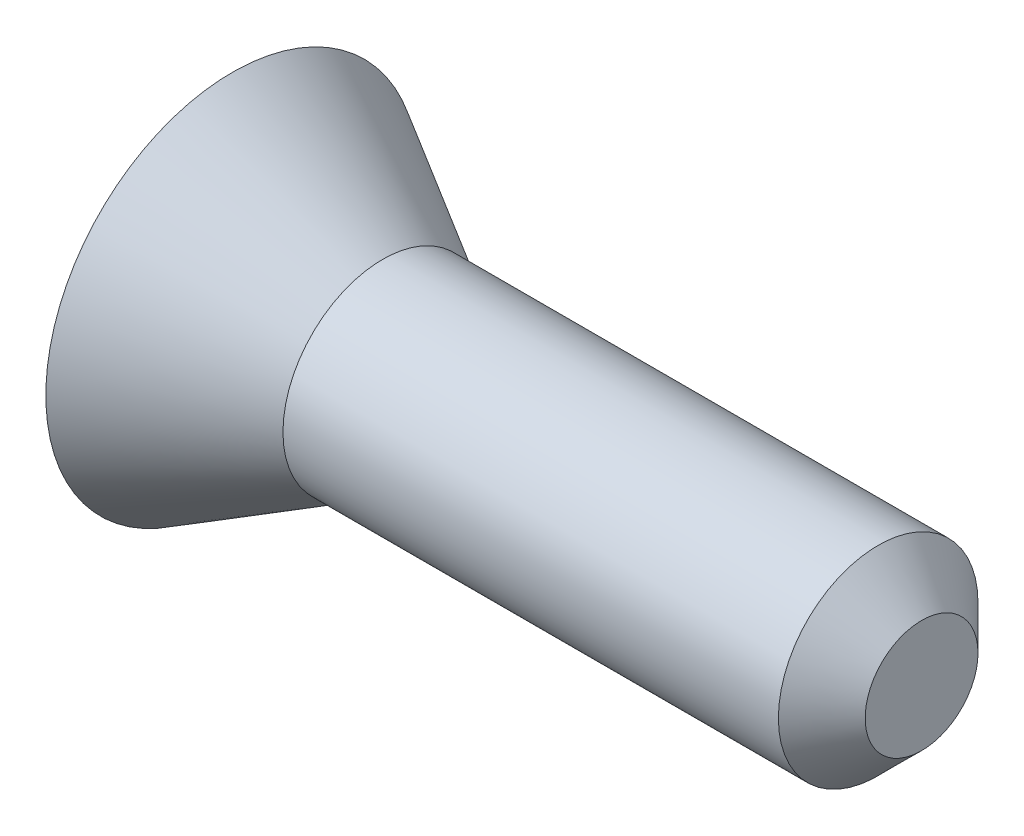
ISO-10303-21;
HEADER;
FILE_DESCRIPTION(('STEP AP214'),'2;1');
FILE_NAME('part.step','',(''),(''),'','','');
FILE_SCHEMA(('AUTOMOTIVE_DESIGN { 1 0 10303 214 1 1 1 1 }'));
ENDSEC;
DATA;
#1=APPLICATION_CONTEXT('core data for automotive mechanical design processes');
#2=APPLICATION_PROTOCOL_DEFINITION('international standard','automotive_design',2000,#1);
#3=PRODUCT_CONTEXT('',#1,'mechanical');
#4=PRODUCT('Part','Part','',(#3));
#5=PRODUCT_RELATED_PRODUCT_CATEGORY('part','',(#4));
#6=PRODUCT_DEFINITION_FORMATION('','',#4);
#7=PRODUCT_DEFINITION_CONTEXT('part definition',#1,'design');
#8=PRODUCT_DEFINITION('design','',#6,#7);
#9=PRODUCT_DEFINITION_SHAPE('','',#8);
#10=(LENGTH_UNIT() NAMED_UNIT(*) SI_UNIT(.MILLI.,.METRE.));
#11=(NAMED_UNIT(*) PLANE_ANGLE_UNIT() SI_UNIT($,.RADIAN.));
#12=(NAMED_UNIT(*) SI_UNIT($,.STERADIAN.) SOLID_ANGLE_UNIT());
#13=UNCERTAINTY_MEASURE_WITH_UNIT(LENGTH_MEASURE(1.E-05),#10,'distance_accuracy_value','');
#14=(GEOMETRIC_REPRESENTATION_CONTEXT(3) GLOBAL_UNCERTAINTY_ASSIGNED_CONTEXT((#13)) GLOBAL_UNIT_ASSIGNED_CONTEXT((#10,
#11,#12)) REPRESENTATION_CONTEXT('',''));
#15=CARTESIAN_POINT('',(0.,0.,0.));
#16=DIRECTION('',(0.,0.,1.));
#17=DIRECTION('',(1.,0.,0.));
#18=AXIS2_PLACEMENT_3D('',#15,#16,#17);
#19=CARTESIAN_POINT('',(2.19970452523541,0.,0.));
#20=DIRECTION('',(-1.,0.,0.));
#21=DIRECTION('',(0.,0.,1.));
#22=AXIS2_PLACEMENT_3D('',#19,#20,#21);
#23=CONICAL_SURFACE('',#22,1.4604999993469,0.523598775598299);
#24=CARTESIAN_POINT('',(-3.97903932025656E-10,0.,0.));
#25=DIRECTION('',(1.,0.,0.));
#26=DIRECTION('',(0.,0.,-1.));
#27=AXIS2_PLACEMENT_3D('',#24,#25,#26);
#28=CIRCLE('',#27,2.73049999935893);
#29=CARTESIAN_POINT('',(-3.97903932025656E-10,0.,-2.73049999935893));
#30=VERTEX_POINT('',#29);
#31=EDGE_CURVE('E11',#30,#30,#28,.T.);
#32=ORIENTED_EDGE('',*,*,#31,.T.);
#33=EDGE_LOOP('',(#32));
#34=FACE_BOUND('',#33,.T.);
#35=CARTESIAN_POINT('',(2.19970452523541,0.,0.));
#36=DIRECTION('',(1.,0.,0.));
#37=DIRECTION('',(0.,0.,-1.));
#38=AXIS2_PLACEMENT_3D('',#35,#36,#37);
#39=CIRCLE('',#38,1.4604999993469);
#40=CARTESIAN_POINT('',(2.19970452523541,0.,-1.4604999993469));
#41=VERTEX_POINT('',#40);
#42=EDGE_CURVE('E127',#41,#41,#39,.T.);
#43=ORIENTED_EDGE('',*,*,#42,.F.);
#44=EDGE_LOOP('',(#43));
#45=FACE_BOUND('',#44,.T.);
#46=ADVANCED_FACE('F32',(#34,#45),#23,.T.);
#47=CARTESIAN_POINT('',(-3.97903932025656E-10,2.73049999935893,0.));
#48=DIRECTION('',(-1.,0.,0.));
#49=DIRECTION('',(0.,0.,1.));
#50=AXIS2_PLACEMENT_3D('',#47,#48,#49);
#51=PLANE('',#50);
#52=DIRECTION('',(0.,1.,0.));
#53=VECTOR('',#52,1.);
#54=CARTESIAN_POINT('',(-3.97903932025656E-10,0.3429,-0.3429));
#55=LINE('',#54,#53);
#56=CARTESIAN_POINT('',(-3.97903932025656E-10,0.3429,-0.3429));
#57=VERTEX_POINT('',#56);
#58=CARTESIAN_POINT('',(-3.97903932025656E-10,1.524,-0.3429));
#59=VERTEX_POINT('',#58);
#60=EDGE_CURVE('E130',#57,#59,#55,.T.);
#61=ORIENTED_EDGE('',*,*,#60,.T.);
#62=DIRECTION('',(0.,0.,1.));
#63=VECTOR('',#62,1.);
#64=CARTESIAN_POINT('',(-3.97903932025656E-10,1.524,-0.3429));
#65=LINE('',#64,#63);
#66=CARTESIAN_POINT('',(-3.97903932025656E-10,1.524,0.3429));
#67=VERTEX_POINT('',#66);
#68=EDGE_CURVE('E119',#59,#67,#65,.T.);
#69=ORIENTED_EDGE('',*,*,#68,.T.);
#70=DIRECTION('',(0.,-1.,0.));
#71=VECTOR('',#70,1.);
#72=CARTESIAN_POINT('',(-3.97903932025656E-10,1.524,0.3429));
#73=LINE('',#72,#71);
#74=CARTESIAN_POINT('',(-3.97903932025656E-10,0.3429,0.3429));
#75=VERTEX_POINT('',#74);
#76=EDGE_CURVE('E406',#67,#75,#73,.T.);
#77=ORIENTED_EDGE('',*,*,#76,.T.);
#78=DIRECTION('',(0.,0.,1.));
#79=VECTOR('',#78,1.);
#80=CARTESIAN_POINT('',(-3.97903932025656E-10,0.3429,0.3429));
#81=LINE('',#80,#79);
#82=CARTESIAN_POINT('',(-3.97903932025656E-10,0.3429,1.524));
#83=VERTEX_POINT('',#82);
#84=EDGE_CURVE('E403',#75,#83,#81,.T.);
#85=ORIENTED_EDGE('',*,*,#84,.T.);
#86=DIRECTION('',(0.,-1.,0.));
#87=VECTOR('',#86,1.);
#88=CARTESIAN_POINT('',(-3.97903932025656E-10,0.3429,1.524));
#89=LINE('',#88,#87);
#90=CARTESIAN_POINT('',(-3.97903932025656E-10,-0.3429,1.524));
#91=VERTEX_POINT('',#90);
#92=EDGE_CURVE('E400',#83,#91,#89,.T.);
#93=ORIENTED_EDGE('',*,*,#92,.T.);
#94=DIRECTION('',(0.,0.,-1.));
#95=VECTOR('',#94,1.);
#96=CARTESIAN_POINT('',(-3.97903932025656E-10,-0.3429,1.524));
#97=LINE('',#96,#95);
#98=CARTESIAN_POINT('',(-3.97903932025656E-10,-0.3429,0.3429));
#99=VERTEX_POINT('',#98);
#100=EDGE_CURVE('E397',#91,#99,#97,.T.);
#101=ORIENTED_EDGE('',*,*,#100,.T.);
#102=DIRECTION('',(0.,-1.,0.));
#103=VECTOR('',#102,1.);
#104=CARTESIAN_POINT('',(-3.97903932025656E-10,-0.3429,0.3429));
#105=LINE('',#104,#103);
#106=CARTESIAN_POINT('',(-3.97903932025656E-10,-1.524,0.3429));
#107=VERTEX_POINT('',#106);
#108=EDGE_CURVE('E393',#99,#107,#105,.T.);
#109=ORIENTED_EDGE('',*,*,#108,.T.);
#110=DIRECTION('',(0.,0.,-1.));
#111=VECTOR('',#110,1.);
#112=CARTESIAN_POINT('',(-3.97903932025656E-10,-1.524,0.3429));
#113=LINE('',#112,#111);
#114=CARTESIAN_POINT('',(-3.97903932025656E-10,-1.524,-0.3429));
#115=VERTEX_POINT('',#114);
#116=EDGE_CURVE('E390',#107,#115,#113,.T.);
#117=ORIENTED_EDGE('',*,*,#116,.T.);
#118=DIRECTION('',(0.,1.,0.));
#119=VECTOR('',#118,1.);
#120=CARTESIAN_POINT('',(-3.97903932025656E-10,-1.524,-0.3429));
#121=LINE('',#120,#119);
#122=CARTESIAN_POINT('',(-3.97903932025656E-10,-0.3429,-0.3429));
#123=VERTEX_POINT('',#122);
#124=EDGE_CURVE('E386',#115,#123,#121,.T.);
#125=ORIENTED_EDGE('',*,*,#124,.T.);
#126=DIRECTION('',(0.,0.,-1.));
#127=VECTOR('',#126,1.);
#128=CARTESIAN_POINT('',(-3.97903932025656E-10,-0.3429,-0.3429));
#129=LINE('',#128,#127);
#130=CARTESIAN_POINT('',(-3.97903932025656E-10,-0.3429,-1.524));
#131=VERTEX_POINT('',#130);
#132=EDGE_CURVE('E384',#123,#131,#129,.T.);
#133=ORIENTED_EDGE('',*,*,#132,.T.);
#134=DIRECTION('',(0.,1.,0.));
#135=VECTOR('',#134,1.);
#136=CARTESIAN_POINT('',(-3.97903932025656E-10,-0.3429,-1.524));
#137=LINE('',#136,#135);
#138=CARTESIAN_POINT('',(-3.97903932025656E-10,0.3429,-1.524));
#139=VERTEX_POINT('',#138);
#140=EDGE_CURVE('E142',#131,#139,#137,.T.);
#141=ORIENTED_EDGE('',*,*,#140,.T.);
#142=DIRECTION('',(0.,0.,1.));
#143=VECTOR('',#142,1.);
#144=CARTESIAN_POINT('',(-3.97903932025656E-10,0.3429,-1.524));
#145=LINE('',#144,#143);
#146=EDGE_CURVE('E138',#139,#57,#145,.T.);
#147=ORIENTED_EDGE('',*,*,#146,.T.);
#148=EDGE_LOOP('',(#61,#69,#77,#85,#93,#101,#109,#117,#125,#133,#141,#147));
#149=FACE_BOUND('',#148,.T.);
#150=ORIENTED_EDGE('',*,*,#31,.F.);
#151=EDGE_LOOP('',(#150));
#152=FACE_BOUND('',#151,.T.);
#153=ADVANCED_FACE('F135',(#149,#152),#51,.T.);
#154=CARTESIAN_POINT('',(10.0837999996509,0.,0.));
#155=DIRECTION('',(1.,0.,0.));
#156=DIRECTION('',(0.,0.,-1.));
#157=AXIS2_PLACEMENT_3D('',#154,#155,#156);
#158=PLANE('',#157);
#159=CARTESIAN_POINT('',(10.0837999996509,0.,0.));
#160=DIRECTION('',(1.,0.,0.));
#161=DIRECTION('',(0.,0.,-1.));
#162=AXIS2_PLACEMENT_3D('',#159,#160,#161);
#163=CIRCLE('',#162,0.825499999318948);
#164=CARTESIAN_POINT('',(10.0837999996509,0.,-0.825499999318948));
#165=VERTEX_POINT('',#164);
#166=EDGE_CURVE('E39',#165,#165,#163,.T.);
#167=ORIENTED_EDGE('',*,*,#166,.T.);
#168=EDGE_LOOP('',(#167));
#169=FACE_BOUND('',#168,.T.);
#170=ADVANCED_FACE('F203',(#169),#158,.T.);
#171=CARTESIAN_POINT('',(10.0837999996509,0.,0.));
#172=DIRECTION('',(-1.,0.,0.));
#173=DIRECTION('',(0.,0.,1.));
#174=AXIS2_PLACEMENT_3D('',#171,#172,#173);
#175=CONICAL_SURFACE('',#174,0.825499999318948,0.785398163397448);
#176=CARTESIAN_POINT('',(9.44879999962293,0.,0.));
#177=DIRECTION('',(1.,0.,0.));
#178=DIRECTION('',(0.,0.,-1.));
#179=AXIS2_PLACEMENT_3D('',#176,#177,#178);
#180=CIRCLE('',#179,1.4604999993469);
#181=CARTESIAN_POINT('',(9.44879999962293,0.,-1.4604999993469));
#182=VERTEX_POINT('',#181);
#183=EDGE_CURVE('E198',#182,#182,#180,.T.);
#184=ORIENTED_EDGE('',*,*,#183,.T.);
#185=EDGE_LOOP('',(#184));
#186=FACE_BOUND('',#185,.T.);
#187=ORIENTED_EDGE('',*,*,#166,.F.);
#188=EDGE_LOOP('',(#187));
#189=FACE_BOUND('',#188,.T.);
#190=ADVANCED_FACE('F205',(#186,#189),#175,.T.);
#191=CARTESIAN_POINT('',(-3.97903932025656E-10,0.,0.));
#192=DIRECTION('',(1.,0.,0.));
#193=DIRECTION('',(0.,0.,-1.));
#194=AXIS2_PLACEMENT_3D('',#191,#192,#193);
#195=CYLINDRICAL_SURFACE('',#194,1.4604999993469);
#196=ORIENTED_EDGE('',*,*,#42,.T.);
#197=EDGE_LOOP('',(#196));
#198=FACE_BOUND('',#197,.T.);
#199=ORIENTED_EDGE('',*,*,#183,.F.);
#200=EDGE_LOOP('',(#199));
#201=FACE_BOUND('',#200,.T.);
#202=ADVANCED_FACE('F207',(#198,#201),#195,.T.);
#203=CARTESIAN_POINT('',(-0.00100000039790385,0.3429,-0.3429));
#204=DIRECTION('',(0.,0.,-1.));
#205=DIRECTION('',(-1.,0.,0.));
#206=AXIS2_PLACEMENT_3D('',#203,#204,#205);
#207=PLANE('',#206);
#208=DIRECTION('',(1.,0.,0.));
#209=VECTOR('',#208,1.);
#210=CARTESIAN_POINT('',(-0.00100000039790385,0.3429,-0.3429));
#211=LINE('',#210,#209);
#212=CARTESIAN_POINT('',(1.905,0.3429,-0.3429));
#213=VERTEX_POINT('',#212);
#214=EDGE_CURVE('E54',#57,#213,#211,.T.);
#215=ORIENTED_EDGE('',*,*,#214,.T.);
#216=DIRECTION('',(0.,1.,0.));
#217=VECTOR('',#216,1.);
#218=CARTESIAN_POINT('',(1.905,0.3429,-0.3429));
#219=LINE('',#218,#217);
#220=CARTESIAN_POINT('',(1.905,1.524,-0.3429));
#221=VERTEX_POINT('',#220);
#222=EDGE_CURVE('E131',#213,#221,#219,.T.);
#223=ORIENTED_EDGE('',*,*,#222,.T.);
#224=DIRECTION('',(1.,0.,0.));
#225=VECTOR('',#224,1.);
#226=CARTESIAN_POINT('',(-0.00100000039790385,1.524,-0.3429));
#227=LINE('',#226,#225);
#228=EDGE_CURVE('E122',#59,#221,#227,.T.);
#229=ORIENTED_EDGE('',*,*,#228,.F.);
#230=ORIENTED_EDGE('',*,*,#60,.F.);
#231=EDGE_LOOP('',(#215,#223,#229,#230));
#232=FACE_BOUND('',#231,.T.);
#233=ADVANCED_FACE('F129',(#232),#207,.F.);
#234=CARTESIAN_POINT('',(-0.00100000039790385,0.3429,-1.524));
#235=DIRECTION('',(0.,1.,0.));
#236=DIRECTION('',(0.,0.,1.));
#237=AXIS2_PLACEMENT_3D('',#234,#235,#236);
#238=PLANE('',#237);
#239=DIRECTION('',(1.,0.,0.));
#240=VECTOR('',#239,1.);
#241=CARTESIAN_POINT('',(-0.00100000039790385,0.3429,-1.524));
#242=LINE('',#241,#240);
#243=CARTESIAN_POINT('',(1.905,0.3429,-1.524));
#244=VERTEX_POINT('',#243);
#245=EDGE_CURVE('E177',#139,#244,#242,.T.);
#246=ORIENTED_EDGE('',*,*,#245,.T.);
#247=DIRECTION('',(0.,0.,1.));
#248=VECTOR('',#247,1.);
#249=CARTESIAN_POINT('',(1.905,0.3429,-1.524));
#250=LINE('',#249,#248);
#251=EDGE_CURVE('E132',#244,#213,#250,.T.);
#252=ORIENTED_EDGE('',*,*,#251,.T.);
#253=ORIENTED_EDGE('',*,*,#214,.F.);
#254=ORIENTED_EDGE('',*,*,#146,.F.);
#255=EDGE_LOOP('',(#246,#252,#253,#254));
#256=FACE_BOUND('',#255,.T.);
#257=ADVANCED_FACE('F254',(#256),#238,.F.);
#258=CARTESIAN_POINT('',(-0.00100000039790385,-0.3429,-1.524));
#259=DIRECTION('',(0.,0.,-1.));
#260=DIRECTION('',(-1.,0.,0.));
#261=AXIS2_PLACEMENT_3D('',#258,#259,#260);
#262=PLANE('',#261);
#263=DIRECTION('',(1.,0.,0.));
#264=VECTOR('',#263,1.);
#265=CARTESIAN_POINT('',(-0.00100000039790385,-0.3429,-1.524));
#266=LINE('',#265,#264);
#267=CARTESIAN_POINT('',(1.905,-0.3429,-1.524));
#268=VERTEX_POINT('',#267);
#269=EDGE_CURVE('E179',#131,#268,#266,.T.);
#270=ORIENTED_EDGE('',*,*,#269,.T.);
#271=DIRECTION('',(0.,1.,0.));
#272=VECTOR('',#271,1.);
#273=CARTESIAN_POINT('',(1.905,-0.3429,-1.524));
#274=LINE('',#273,#272);
#275=EDGE_CURVE('E171',#268,#244,#274,.T.);
#276=ORIENTED_EDGE('',*,*,#275,.T.);
#277=ORIENTED_EDGE('',*,*,#245,.F.);
#278=ORIENTED_EDGE('',*,*,#140,.F.);
#279=EDGE_LOOP('',(#270,#276,#277,#278));
#280=FACE_BOUND('',#279,.T.);
#281=ADVANCED_FACE('F260',(#280),#262,.F.);
#282=CARTESIAN_POINT('',(-0.00100000039790385,-0.3429,-0.3429));
#283=DIRECTION('',(0.,-1.,0.));
#284=DIRECTION('',(0.,0.,-1.));
#285=AXIS2_PLACEMENT_3D('',#282,#283,#284);
#286=PLANE('',#285);
#287=DIRECTION('',(1.,0.,0.));
#288=VECTOR('',#287,1.);
#289=CARTESIAN_POINT('',(-0.00100000039790385,-0.3429,-0.3429));
#290=LINE('',#289,#288);
#291=CARTESIAN_POINT('',(1.905,-0.3429,-0.3429));
#292=VERTEX_POINT('',#291);
#293=EDGE_CURVE('E181',#123,#292,#290,.T.);
#294=ORIENTED_EDGE('',*,*,#293,.T.);
#295=DIRECTION('',(0.,0.,-1.));
#296=VECTOR('',#295,1.);
#297=CARTESIAN_POINT('',(1.905,-0.3429,-0.3429));
#298=LINE('',#297,#296);
#299=EDGE_CURVE('E168',#292,#268,#298,.T.);
#300=ORIENTED_EDGE('',*,*,#299,.T.);
#301=ORIENTED_EDGE('',*,*,#269,.F.);
#302=ORIENTED_EDGE('',*,*,#132,.F.);
#303=EDGE_LOOP('',(#294,#300,#301,#302));
#304=FACE_BOUND('',#303,.T.);
#305=ADVANCED_FACE('F268',(#304),#286,.F.);
#306=CARTESIAN_POINT('',(-0.00100000039790385,-1.524,-0.3429));
#307=DIRECTION('',(0.,0.,-1.));
#308=DIRECTION('',(-1.,0.,0.));
#309=AXIS2_PLACEMENT_3D('',#306,#307,#308);
#310=PLANE('',#309);
#311=DIRECTION('',(1.,0.,0.));
#312=VECTOR('',#311,1.);
#313=CARTESIAN_POINT('',(-0.00100000039790385,-1.524,-0.3429));
#314=LINE('',#313,#312);
#315=CARTESIAN_POINT('',(1.905,-1.524,-0.3429));
#316=VERTEX_POINT('',#315);
#317=EDGE_CURVE('E183',#115,#316,#314,.T.);
#318=ORIENTED_EDGE('',*,*,#317,.T.);
#319=DIRECTION('',(0.,1.,0.));
#320=VECTOR('',#319,1.);
#321=CARTESIAN_POINT('',(1.905,-1.524,-0.3429));
#322=LINE('',#321,#320);
#323=EDGE_CURVE('E165',#316,#292,#322,.T.);
#324=ORIENTED_EDGE('',*,*,#323,.T.);
#325=ORIENTED_EDGE('',*,*,#293,.F.);
#326=ORIENTED_EDGE('',*,*,#124,.F.);
#327=EDGE_LOOP('',(#318,#324,#325,#326));
#328=FACE_BOUND('',#327,.T.);
#329=ADVANCED_FACE('F276',(#328),#310,.F.);
#330=CARTESIAN_POINT('',(-0.00100000039790385,-1.524,0.3429));
#331=DIRECTION('',(0.,-1.,0.));
#332=DIRECTION('',(0.,0.,-1.));
#333=AXIS2_PLACEMENT_3D('',#330,#331,#332);
#334=PLANE('',#333);
#335=DIRECTION('',(1.,0.,0.));
#336=VECTOR('',#335,1.);
#337=CARTESIAN_POINT('',(-0.00100000039790385,-1.524,0.3429));
#338=LINE('',#337,#336);
#339=CARTESIAN_POINT('',(1.905,-1.524,0.3429));
#340=VERTEX_POINT('',#339);
#341=EDGE_CURVE('E185',#107,#340,#338,.T.);
#342=ORIENTED_EDGE('',*,*,#341,.T.);
#343=DIRECTION('',(0.,0.,-1.));
#344=VECTOR('',#343,1.);
#345=CARTESIAN_POINT('',(1.905,-1.524,0.3429));
#346=LINE('',#345,#344);
#347=EDGE_CURVE('E162',#340,#316,#346,.T.);
#348=ORIENTED_EDGE('',*,*,#347,.T.);
#349=ORIENTED_EDGE('',*,*,#317,.F.);
#350=ORIENTED_EDGE('',*,*,#116,.F.);
#351=EDGE_LOOP('',(#342,#348,#349,#350));
#352=FACE_BOUND('',#351,.T.);
#353=ADVANCED_FACE('F284',(#352),#334,.F.);
#354=CARTESIAN_POINT('',(-0.00100000039790385,-0.3429,0.3429));
#355=DIRECTION('',(0.,0.,1.));
#356=DIRECTION('',(1.,0.,0.));
#357=AXIS2_PLACEMENT_3D('',#354,#355,#356);
#358=PLANE('',#357);
#359=DIRECTION('',(1.,0.,0.));
#360=VECTOR('',#359,1.);
#361=CARTESIAN_POINT('',(-0.00100000039790385,-0.3429,0.3429));
#362=LINE('',#361,#360);
#363=CARTESIAN_POINT('',(1.905,-0.3429,0.3429));
#364=VERTEX_POINT('',#363);
#365=EDGE_CURVE('E187',#99,#364,#362,.T.);
#366=ORIENTED_EDGE('',*,*,#365,.T.);
#367=DIRECTION('',(0.,-1.,0.));
#368=VECTOR('',#367,1.);
#369=CARTESIAN_POINT('',(1.905,-0.3429,0.3429));
#370=LINE('',#369,#368);
#371=EDGE_CURVE('E159',#364,#340,#370,.T.);
#372=ORIENTED_EDGE('',*,*,#371,.T.);
#373=ORIENTED_EDGE('',*,*,#341,.F.);
#374=ORIENTED_EDGE('',*,*,#108,.F.);
#375=EDGE_LOOP('',(#366,#372,#373,#374));
#376=FACE_BOUND('',#375,.T.);
#377=ADVANCED_FACE('F292',(#376),#358,.F.);
#378=CARTESIAN_POINT('',(-0.00100000039790385,-0.3429,1.524));
#379=DIRECTION('',(0.,-1.,0.));
#380=DIRECTION('',(0.,0.,-1.));
#381=AXIS2_PLACEMENT_3D('',#378,#379,#380);
#382=PLANE('',#381);
#383=DIRECTION('',(1.,0.,0.));
#384=VECTOR('',#383,1.);
#385=CARTESIAN_POINT('',(-0.00100000039790385,-0.3429,1.524));
#386=LINE('',#385,#384);
#387=CARTESIAN_POINT('',(1.905,-0.3429,1.524));
#388=VERTEX_POINT('',#387);
#389=EDGE_CURVE('E189',#91,#388,#386,.T.);
#390=ORIENTED_EDGE('',*,*,#389,.T.);
#391=DIRECTION('',(0.,0.,-1.));
#392=VECTOR('',#391,1.);
#393=CARTESIAN_POINT('',(1.905,-0.3429,1.524));
#394=LINE('',#393,#392);
#395=EDGE_CURVE('E156',#388,#364,#394,.T.);
#396=ORIENTED_EDGE('',*,*,#395,.T.);
#397=ORIENTED_EDGE('',*,*,#365,.F.);
#398=ORIENTED_EDGE('',*,*,#100,.F.);
#399=EDGE_LOOP('',(#390,#396,#397,#398));
#400=FACE_BOUND('',#399,.T.);
#401=ADVANCED_FACE('F300',(#400),#382,.F.);
#402=CARTESIAN_POINT('',(-0.00100000039790385,0.3429,1.524));
#403=DIRECTION('',(0.,0.,1.));
#404=DIRECTION('',(1.,0.,0.));
#405=AXIS2_PLACEMENT_3D('',#402,#403,#404);
#406=PLANE('',#405);
#407=DIRECTION('',(1.,0.,0.));
#408=VECTOR('',#407,1.);
#409=CARTESIAN_POINT('',(-0.00100000039790385,0.3429,1.524));
#410=LINE('',#409,#408);
#411=CARTESIAN_POINT('',(1.905,0.3429,1.524));
#412=VERTEX_POINT('',#411);
#413=EDGE_CURVE('E191',#83,#412,#410,.T.);
#414=ORIENTED_EDGE('',*,*,#413,.T.);
#415=DIRECTION('',(0.,-1.,0.));
#416=VECTOR('',#415,1.);
#417=CARTESIAN_POINT('',(1.905,0.3429,1.524));
#418=LINE('',#417,#416);
#419=EDGE_CURVE('E153',#412,#388,#418,.T.);
#420=ORIENTED_EDGE('',*,*,#419,.T.);
#421=ORIENTED_EDGE('',*,*,#389,.F.);
#422=ORIENTED_EDGE('',*,*,#92,.F.);
#423=EDGE_LOOP('',(#414,#420,#421,#422));
#424=FACE_BOUND('',#423,.T.);
#425=ADVANCED_FACE('F308',(#424),#406,.F.);
#426=CARTESIAN_POINT('',(-0.00100000039790385,0.3429,0.3429));
#427=DIRECTION('',(0.,1.,0.));
#428=DIRECTION('',(0.,0.,1.));
#429=AXIS2_PLACEMENT_3D('',#426,#427,#428);
#430=PLANE('',#429);
#431=DIRECTION('',(1.,0.,0.));
#432=VECTOR('',#431,1.);
#433=CARTESIAN_POINT('',(-0.00100000039790385,0.3429,0.3429));
#434=LINE('',#433,#432);
#435=CARTESIAN_POINT('',(1.905,0.3429,0.3429));
#436=VERTEX_POINT('',#435);
#437=EDGE_CURVE('E193',#75,#436,#434,.T.);
#438=ORIENTED_EDGE('',*,*,#437,.T.);
#439=DIRECTION('',(0.,0.,1.));
#440=VECTOR('',#439,1.);
#441=CARTESIAN_POINT('',(1.905,0.3429,0.3429));
#442=LINE('',#441,#440);
#443=EDGE_CURVE('E150',#436,#412,#442,.T.);
#444=ORIENTED_EDGE('',*,*,#443,.T.);
#445=ORIENTED_EDGE('',*,*,#413,.F.);
#446=ORIENTED_EDGE('',*,*,#84,.F.);
#447=EDGE_LOOP('',(#438,#444,#445,#446));
#448=FACE_BOUND('',#447,.T.);
#449=ADVANCED_FACE('F316',(#448),#430,.F.);
#450=CARTESIAN_POINT('',(-0.00100000039790385,1.524,0.3429));
#451=DIRECTION('',(0.,0.,1.));
#452=DIRECTION('',(1.,0.,0.));
#453=AXIS2_PLACEMENT_3D('',#450,#451,#452);
#454=PLANE('',#453);
#455=DIRECTION('',(1.,0.,0.));
#456=VECTOR('',#455,1.);
#457=CARTESIAN_POINT('',(-0.00100000039790385,1.524,0.3429));
#458=LINE('',#457,#456);
#459=CARTESIAN_POINT('',(1.905,1.524,0.3429));
#460=VERTEX_POINT('',#459);
#461=EDGE_CURVE('E46',#67,#460,#458,.T.);
#462=ORIENTED_EDGE('',*,*,#461,.T.);
#463=DIRECTION('',(0.,-1.,0.));
#464=VECTOR('',#463,1.);
#465=CARTESIAN_POINT('',(1.905,1.524,0.3429));
#466=LINE('',#465,#464);
#467=EDGE_CURVE('E147',#460,#436,#466,.T.);
#468=ORIENTED_EDGE('',*,*,#467,.T.);
#469=ORIENTED_EDGE('',*,*,#437,.F.);
#470=ORIENTED_EDGE('',*,*,#76,.F.);
#471=EDGE_LOOP('',(#462,#468,#469,#470));
#472=FACE_BOUND('',#471,.T.);
#473=ADVANCED_FACE('F324',(#472),#454,.F.);
#474=CARTESIAN_POINT('',(-0.00100000039790385,1.524,-0.3429));
#475=DIRECTION('',(0.,1.,0.));
#476=DIRECTION('',(0.,0.,1.));
#477=AXIS2_PLACEMENT_3D('',#474,#475,#476);
#478=PLANE('',#477);
#479=ORIENTED_EDGE('',*,*,#228,.T.);
#480=DIRECTION('',(0.,0.,1.));
#481=VECTOR('',#480,1.);
#482=CARTESIAN_POINT('',(1.905,1.524,-0.3429));
#483=LINE('',#482,#481);
#484=EDGE_CURVE('E140',#221,#460,#483,.T.);
#485=ORIENTED_EDGE('',*,*,#484,.T.);
#486=ORIENTED_EDGE('',*,*,#461,.F.);
#487=ORIENTED_EDGE('',*,*,#68,.F.);
#488=EDGE_LOOP('',(#479,#485,#486,#487));
#489=FACE_BOUND('',#488,.T.);
#490=ADVANCED_FACE('F121',(#489),#478,.F.);
#491=CARTESIAN_POINT('',(1.905,1.524,-0.3429));
#492=DIRECTION('',(1.,0.,0.));
#493=DIRECTION('',(0.,0.,-1.));
#494=AXIS2_PLACEMENT_3D('',#491,#492,#493);
#495=PLANE('',#494);
#496=ORIENTED_EDGE('',*,*,#222,.F.);
#497=ORIENTED_EDGE('',*,*,#251,.F.);
#498=ORIENTED_EDGE('',*,*,#275,.F.);
#499=ORIENTED_EDGE('',*,*,#299,.F.);
#500=ORIENTED_EDGE('',*,*,#323,.F.);
#501=ORIENTED_EDGE('',*,*,#347,.F.);
#502=ORIENTED_EDGE('',*,*,#371,.F.);
#503=ORIENTED_EDGE('',*,*,#395,.F.);
#504=ORIENTED_EDGE('',*,*,#419,.F.);
#505=ORIENTED_EDGE('',*,*,#443,.F.);
#506=ORIENTED_EDGE('',*,*,#467,.F.);
#507=ORIENTED_EDGE('',*,*,#484,.F.);
#508=EDGE_LOOP('',(#496,#497,#498,#499,#500,#501,#502,#503,#504,#505,#506,#507));
#509=FACE_BOUND('',#508,.T.);
#510=ADVANCED_FACE('F339',(#509),#495,.F.);
#511=CLOSED_SHELL('',(#46,#153,#170,#190,#202,#233,#257,#281,#305,#329,#353,#377,#401,#425,#449,
#473,#490,#510));
#512=MANIFOLD_SOLID_BREP('B2',#511);
#513=ADVANCED_BREP_SHAPE_REPRESENTATION('',(#18,#512),#14);
#514=SHAPE_DEFINITION_REPRESENTATION(#9,#513);
ENDSEC;
END-ISO-10303-21;
